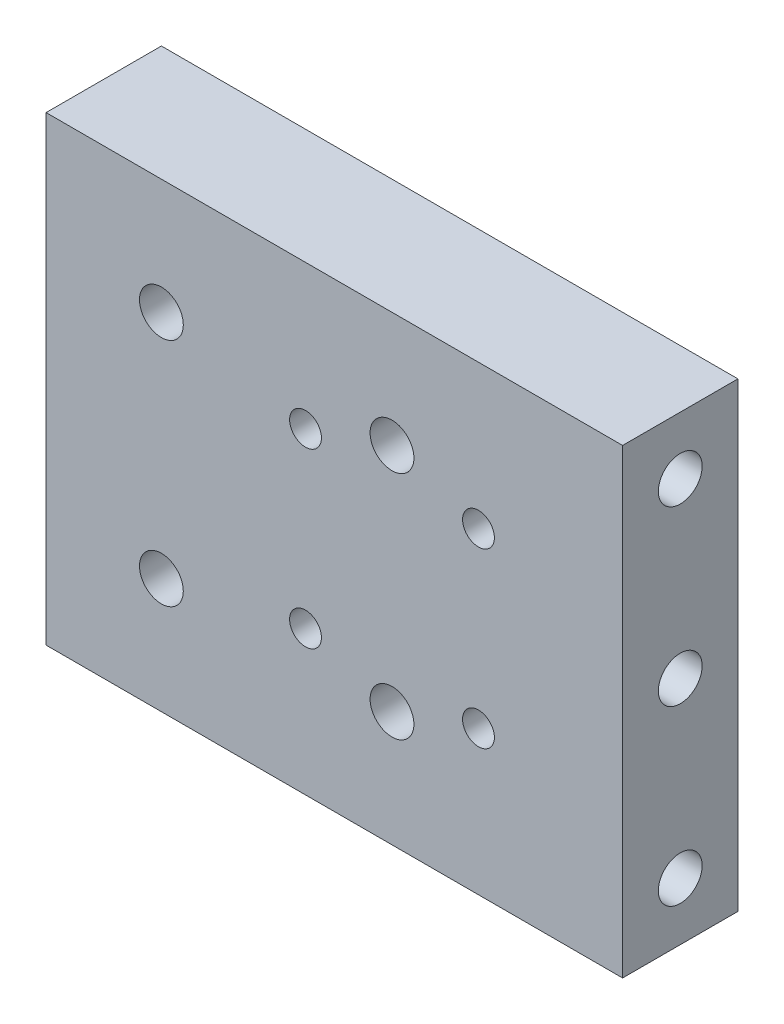
ISO-10303-21;
HEADER;
FILE_DESCRIPTION(('STEP AP214'),'2;1');
FILE_NAME('part.step','',(''),(''),'','','');
FILE_SCHEMA(('AUTOMOTIVE_DESIGN { 1 0 10303 214 1 1 1 1 }'));
ENDSEC;
DATA;
#1=APPLICATION_CONTEXT('core data for automotive mechanical design processes');
#2=APPLICATION_PROTOCOL_DEFINITION('international standard','automotive_design',2000,#1);
#3=PRODUCT_CONTEXT('',#1,'mechanical');
#4=PRODUCT('Part','Part','',(#3));
#5=PRODUCT_RELATED_PRODUCT_CATEGORY('part','',(#4));
#6=PRODUCT_DEFINITION_FORMATION('','',#4);
#7=PRODUCT_DEFINITION_CONTEXT('part definition',#1,'design');
#8=PRODUCT_DEFINITION('design','',#6,#7);
#9=PRODUCT_DEFINITION_SHAPE('','',#8);
#10=(LENGTH_UNIT() NAMED_UNIT(*) SI_UNIT(.MILLI.,.METRE.));
#11=(NAMED_UNIT(*) PLANE_ANGLE_UNIT() SI_UNIT($,.RADIAN.));
#12=(NAMED_UNIT(*) SI_UNIT($,.STERADIAN.) SOLID_ANGLE_UNIT());
#13=UNCERTAINTY_MEASURE_WITH_UNIT(LENGTH_MEASURE(1.E-05),#10,'distance_accuracy_value','');
#14=(GEOMETRIC_REPRESENTATION_CONTEXT(3) GLOBAL_UNCERTAINTY_ASSIGNED_CONTEXT((#13)) GLOBAL_UNIT_ASSIGNED_CONTEXT((#10,
#11,#12)) REPRESENTATION_CONTEXT('',''));
#15=CARTESIAN_POINT('',(0.,0.,0.));
#16=DIRECTION('',(0.,0.,1.));
#17=DIRECTION('',(1.,0.,0.));
#18=AXIS2_PLACEMENT_3D('',#15,#16,#17);
#19=CARTESIAN_POINT('',(0.,0.,6.35));
#20=DIRECTION('',(-1.,0.,0.));
#21=DIRECTION('',(0.,0.,1.));
#22=AXIS2_PLACEMENT_3D('',#19,#20,#21);
#23=PLANE('',#22);
#24=CARTESIAN_POINT('',(0.,44.45,0.));
#25=DIRECTION('',(1.,0.,0.));
#26=DIRECTION('',(0.,0.,-1.));
#27=AXIS2_PLACEMENT_3D('',#24,#25,#26);
#28=CIRCLE('',#27,2.41299999999999);
#29=CARTESIAN_POINT('',(0.,44.45,-2.41299999999999));
#30=VERTEX_POINT('',#29);
#31=EDGE_CURVE('E138',#30,#30,#28,.T.);
#32=ORIENTED_EDGE('',*,*,#31,.F.);
#33=EDGE_LOOP('',(#32));
#34=FACE_BOUND('',#33,.T.);
#35=CARTESIAN_POINT('',(0.,25.4,0.));
#36=DIRECTION('',(1.,0.,0.));
#37=DIRECTION('',(0.,0.,-1.));
#38=AXIS2_PLACEMENT_3D('',#35,#36,#37);
#39=CIRCLE('',#38,2.41299999999999);
#40=CARTESIAN_POINT('',(0.,25.4,-2.413));
#41=VERTEX_POINT('',#40);
#42=EDGE_CURVE('E132',#41,#41,#39,.T.);
#43=ORIENTED_EDGE('',*,*,#42,.F.);
#44=EDGE_LOOP('',(#43));
#45=FACE_BOUND('',#44,.T.);
#46=CARTESIAN_POINT('',(0.,6.35,0.));
#47=DIRECTION('',(1.,0.,0.));
#48=DIRECTION('',(0.,0.,-1.));
#49=AXIS2_PLACEMENT_3D('',#46,#47,#48);
#50=CIRCLE('',#49,2.41299999999999);
#51=CARTESIAN_POINT('',(0.,6.35,-2.413));
#52=VERTEX_POINT('',#51);
#53=EDGE_CURVE('E126',#52,#52,#50,.T.);
#54=ORIENTED_EDGE('',*,*,#53,.F.);
#55=EDGE_LOOP('',(#54));
#56=FACE_BOUND('',#55,.T.);
#57=DIRECTION('',(0.,1.,0.));
#58=VECTOR('',#57,1.);
#59=CARTESIAN_POINT('',(0.,0.,-6.35));
#60=LINE('',#59,#58);
#61=CARTESIAN_POINT('',(0.,0.,-6.35));
#62=VERTEX_POINT('',#61);
#63=CARTESIAN_POINT('',(0.,50.8,-6.35));
#64=VERTEX_POINT('',#63);
#65=EDGE_CURVE('E110',#62,#64,#60,.T.);
#66=ORIENTED_EDGE('',*,*,#65,.T.);
#67=DIRECTION('',(0.,0.,-1.));
#68=VECTOR('',#67,1.);
#69=CARTESIAN_POINT('',(0.,50.8,6.35));
#70=LINE('',#69,#68);
#71=CARTESIAN_POINT('',(0.,50.8,6.35));
#72=VERTEX_POINT('',#71);
#73=EDGE_CURVE('E13',#72,#64,#70,.T.);
#74=ORIENTED_EDGE('',*,*,#73,.F.);
#75=DIRECTION('',(0.,1.,0.));
#76=VECTOR('',#75,1.);
#77=CARTESIAN_POINT('',(0.,0.,6.35));
#78=LINE('',#77,#76);
#79=CARTESIAN_POINT('',(0.,0.,6.35));
#80=VERTEX_POINT('',#79);
#81=EDGE_CURVE('E98',#80,#72,#78,.T.);
#82=ORIENTED_EDGE('',*,*,#81,.F.);
#83=DIRECTION('',(0.,0.,-1.));
#84=VECTOR('',#83,1.);
#85=CARTESIAN_POINT('',(0.,0.,6.35));
#86=LINE('',#85,#84);
#87=EDGE_CURVE('E106',#80,#62,#86,.T.);
#88=ORIENTED_EDGE('',*,*,#87,.T.);
#89=EDGE_LOOP('',(#66,#74,#82,#88));
#90=FACE_BOUND('',#89,.T.);
#91=ADVANCED_FACE('F47',(#34,#45,#56,#90),#23,.F.);
#92=CARTESIAN_POINT('',(0.,50.8,6.35));
#93=DIRECTION('',(0.,-1.,0.));
#94=DIRECTION('',(1.,0.,0.));
#95=AXIS2_PLACEMENT_3D('',#92,#93,#94);
#96=PLANE('',#95);
#97=DIRECTION('',(-1.,0.,0.));
#98=VECTOR('',#97,1.);
#99=CARTESIAN_POINT('',(0.,50.8,-6.35));
#100=LINE('',#99,#98);
#101=CARTESIAN_POINT('',(-63.5,50.8,-6.35));
#102=VERTEX_POINT('',#101);
#103=EDGE_CURVE('E102',#64,#102,#100,.T.);
#104=ORIENTED_EDGE('',*,*,#103,.T.);
#105=DIRECTION('',(0.,0.,-1.));
#106=VECTOR('',#105,1.);
#107=CARTESIAN_POINT('',(-63.5,50.8,6.35));
#108=LINE('',#107,#106);
#109=CARTESIAN_POINT('',(-63.5,50.8,6.35));
#110=VERTEX_POINT('',#109);
#111=EDGE_CURVE('E55',#110,#102,#108,.T.);
#112=ORIENTED_EDGE('',*,*,#111,.F.);
#113=DIRECTION('',(-1.,0.,0.));
#114=VECTOR('',#113,1.);
#115=CARTESIAN_POINT('',(0.,50.8,6.35));
#116=LINE('',#115,#114);
#117=EDGE_CURVE('E93',#72,#110,#116,.T.);
#118=ORIENTED_EDGE('',*,*,#117,.F.);
#119=ORIENTED_EDGE('',*,*,#73,.T.);
#120=EDGE_LOOP('',(#104,#112,#118,#119));
#121=FACE_BOUND('',#120,.T.);
#122=ADVANCED_FACE('F101',(#121),#96,.F.);
#123=CARTESIAN_POINT('',(-63.5,0.,6.35));
#124=DIRECTION('',(1.,0.,0.));
#125=DIRECTION('',(0.,0.,-1.));
#126=AXIS2_PLACEMENT_3D('',#123,#124,#125);
#127=PLANE('',#126);
#128=CARTESIAN_POINT('',(-63.5,44.45,0.));
#129=DIRECTION('',(1.,0.,0.));
#130=DIRECTION('',(0.,0.,-1.));
#131=AXIS2_PLACEMENT_3D('',#128,#129,#130);
#132=CIRCLE('',#131,2.41299999999998);
#133=CARTESIAN_POINT('',(-63.5,44.45,-2.41299999999999));
#134=VERTEX_POINT('',#133);
#135=EDGE_CURVE('E135',#134,#134,#132,.T.);
#136=ORIENTED_EDGE('',*,*,#135,.T.);
#137=EDGE_LOOP('',(#136));
#138=FACE_BOUND('',#137,.T.);
#139=CARTESIAN_POINT('',(-63.5,25.4,0.));
#140=DIRECTION('',(1.,0.,0.));
#141=DIRECTION('',(0.,0.,-1.));
#142=AXIS2_PLACEMENT_3D('',#139,#140,#141);
#143=CIRCLE('',#142,2.41299999999998);
#144=CARTESIAN_POINT('',(-63.5,25.4,-2.41299999999999));
#145=VERTEX_POINT('',#144);
#146=EDGE_CURVE('E129',#145,#145,#143,.T.);
#147=ORIENTED_EDGE('',*,*,#146,.T.);
#148=EDGE_LOOP('',(#147));
#149=FACE_BOUND('',#148,.T.);
#150=CARTESIAN_POINT('',(-63.5,6.35,0.));
#151=DIRECTION('',(1.,0.,0.));
#152=DIRECTION('',(0.,0.,-1.));
#153=AXIS2_PLACEMENT_3D('',#150,#151,#152);
#154=CIRCLE('',#153,2.41299999999998);
#155=CARTESIAN_POINT('',(-63.5,6.35,-2.41299999999999));
#156=VERTEX_POINT('',#155);
#157=EDGE_CURVE('E113',#156,#156,#154,.T.);
#158=ORIENTED_EDGE('',*,*,#157,.T.);
#159=EDGE_LOOP('',(#158));
#160=FACE_BOUND('',#159,.T.);
#161=DIRECTION('',(0.,-1.,0.));
#162=VECTOR('',#161,1.);
#163=CARTESIAN_POINT('',(-63.5,0.,-6.35));
#164=LINE('',#163,#162);
#165=CARTESIAN_POINT('',(-63.5,0.,-6.35));
#166=VERTEX_POINT('',#165);
#167=EDGE_CURVE('E80',#102,#166,#164,.T.);
#168=ORIENTED_EDGE('',*,*,#167,.T.);
#169=DIRECTION('',(0.,0.,-1.));
#170=VECTOR('',#169,1.);
#171=CARTESIAN_POINT('',(-63.5,0.,6.35));
#172=LINE('',#171,#170);
#173=CARTESIAN_POINT('',(-63.5,0.,6.35));
#174=VERTEX_POINT('',#173);
#175=EDGE_CURVE('E103',#174,#166,#172,.T.);
#176=ORIENTED_EDGE('',*,*,#175,.F.);
#177=DIRECTION('',(0.,-1.,0.));
#178=VECTOR('',#177,1.);
#179=CARTESIAN_POINT('',(-63.5,0.,6.35));
#180=LINE('',#179,#178);
#181=EDGE_CURVE('E96',#110,#174,#180,.T.);
#182=ORIENTED_EDGE('',*,*,#181,.F.);
#183=ORIENTED_EDGE('',*,*,#111,.T.);
#184=EDGE_LOOP('',(#168,#176,#182,#183));
#185=FACE_BOUND('',#184,.T.);
#186=ADVANCED_FACE('F104',(#138,#149,#160,#185),#127,.F.);
#187=CARTESIAN_POINT('',(0.,0.,6.35));
#188=DIRECTION('',(0.,1.,0.));
#189=DIRECTION('',(-1.,0.,0.));
#190=AXIS2_PLACEMENT_3D('',#187,#188,#189);
#191=PLANE('',#190);
#192=DIRECTION('',(1.,0.,0.));
#193=VECTOR('',#192,1.);
#194=CARTESIAN_POINT('',(0.,0.,-6.35));
#195=LINE('',#194,#193);
#196=EDGE_CURVE('E86',#166,#62,#195,.T.);
#197=ORIENTED_EDGE('',*,*,#196,.T.);
#198=ORIENTED_EDGE('',*,*,#87,.F.);
#199=DIRECTION('',(1.,0.,0.));
#200=VECTOR('',#199,1.);
#201=CARTESIAN_POINT('',(0.,0.,6.35));
#202=LINE('',#201,#200);
#203=EDGE_CURVE('E63',#174,#80,#202,.T.);
#204=ORIENTED_EDGE('',*,*,#203,.F.);
#205=ORIENTED_EDGE('',*,*,#175,.T.);
#206=EDGE_LOOP('',(#197,#198,#204,#205));
#207=FACE_BOUND('',#206,.T.);
#208=ADVANCED_FACE('F118',(#207),#191,.F.);
#209=CARTESIAN_POINT('',(0.,0.,6.35));
#210=DIRECTION('',(0.,0.,1.));
#211=DIRECTION('',(1.,0.,0.));
#212=AXIS2_PLACEMENT_3D('',#209,#210,#211);
#213=PLANE('',#212);
#214=CARTESIAN_POINT('',(-34.925,34.925,6.35));
#215=DIRECTION('',(0.,0.,1.));
#216=DIRECTION('',(1.,0.,0.));
#217=AXIS2_PLACEMENT_3D('',#214,#215,#216);
#218=CIRCLE('',#217,1.7526);
#219=CARTESIAN_POINT('',(-33.1724,34.925,6.35));
#220=VERTEX_POINT('',#219);
#221=EDGE_CURVE('E186',#220,#220,#218,.T.);
#222=ORIENTED_EDGE('',*,*,#221,.F.);
#223=EDGE_LOOP('',(#222));
#224=FACE_BOUND('',#223,.T.);
#225=CARTESIAN_POINT('',(-15.875,34.925,6.35));
#226=DIRECTION('',(0.,0.,1.));
#227=DIRECTION('',(1.,0.,0.));
#228=AXIS2_PLACEMENT_3D('',#225,#226,#227);
#229=CIRCLE('',#228,1.7526);
#230=CARTESIAN_POINT('',(-14.1224,34.925,6.35));
#231=VERTEX_POINT('',#230);
#232=EDGE_CURVE('E180',#231,#231,#229,.T.);
#233=ORIENTED_EDGE('',*,*,#232,.F.);
#234=EDGE_LOOP('',(#233));
#235=FACE_BOUND('',#234,.T.);
#236=CARTESIAN_POINT('',(-15.875,15.875,6.35));
#237=DIRECTION('',(0.,0.,1.));
#238=DIRECTION('',(1.,0.,0.));
#239=AXIS2_PLACEMENT_3D('',#236,#237,#238);
#240=CIRCLE('',#239,1.7526);
#241=CARTESIAN_POINT('',(-14.1224,15.875,6.35));
#242=VERTEX_POINT('',#241);
#243=EDGE_CURVE('E174',#242,#242,#240,.T.);
#244=ORIENTED_EDGE('',*,*,#243,.F.);
#245=EDGE_LOOP('',(#244));
#246=FACE_BOUND('',#245,.T.);
#247=CARTESIAN_POINT('',(-34.925,15.875,6.35));
#248=DIRECTION('',(0.,0.,1.));
#249=DIRECTION('',(1.,0.,0.));
#250=AXIS2_PLACEMENT_3D('',#247,#248,#249);
#251=CIRCLE('',#250,1.7526);
#252=CARTESIAN_POINT('',(-33.1724,15.875,6.35));
#253=VERTEX_POINT('',#252);
#254=EDGE_CURVE('E168',#253,#253,#251,.T.);
#255=ORIENTED_EDGE('',*,*,#254,.F.);
#256=EDGE_LOOP('',(#255));
#257=FACE_BOUND('',#256,.T.);
#258=CARTESIAN_POINT('',(-50.8,38.1,6.35));
#259=DIRECTION('',(0.,0.,1.));
#260=DIRECTION('',(1.,0.,0.));
#261=AXIS2_PLACEMENT_3D('',#258,#259,#260);
#262=CIRCLE('',#261,2.41299999999998);
#263=CARTESIAN_POINT('',(-48.387,38.1,6.35));
#264=VERTEX_POINT('',#263);
#265=EDGE_CURVE('E162',#264,#264,#262,.T.);
#266=ORIENTED_EDGE('',*,*,#265,.F.);
#267=EDGE_LOOP('',(#266));
#268=FACE_BOUND('',#267,.T.);
#269=CARTESIAN_POINT('',(-25.4,38.1,6.35));
#270=DIRECTION('',(0.,0.,1.));
#271=DIRECTION('',(1.,0.,0.));
#272=AXIS2_PLACEMENT_3D('',#269,#270,#271);
#273=CIRCLE('',#272,2.41299999999999);
#274=CARTESIAN_POINT('',(-22.987,38.1,6.35));
#275=VERTEX_POINT('',#274);
#276=EDGE_CURVE('E156',#275,#275,#273,.T.);
#277=ORIENTED_EDGE('',*,*,#276,.F.);
#278=EDGE_LOOP('',(#277));
#279=FACE_BOUND('',#278,.T.);
#280=CARTESIAN_POINT('',(-50.8,12.7,6.35));
#281=DIRECTION('',(0.,0.,1.));
#282=DIRECTION('',(1.,0.,0.));
#283=AXIS2_PLACEMENT_3D('',#280,#281,#282);
#284=CIRCLE('',#283,2.41299999999998);
#285=CARTESIAN_POINT('',(-48.387,12.7,6.35));
#286=VERTEX_POINT('',#285);
#287=EDGE_CURVE('E150',#286,#286,#284,.T.);
#288=ORIENTED_EDGE('',*,*,#287,.F.);
#289=EDGE_LOOP('',(#288));
#290=FACE_BOUND('',#289,.T.);
#291=CARTESIAN_POINT('',(-25.4,12.7,6.35));
#292=DIRECTION('',(0.,0.,1.));
#293=DIRECTION('',(1.,0.,0.));
#294=AXIS2_PLACEMENT_3D('',#291,#292,#293);
#295=CIRCLE('',#294,2.41299999999999);
#296=CARTESIAN_POINT('',(-22.987,12.7,6.35));
#297=VERTEX_POINT('',#296);
#298=EDGE_CURVE('E144',#297,#297,#295,.T.);
#299=ORIENTED_EDGE('',*,*,#298,.F.);
#300=EDGE_LOOP('',(#299));
#301=FACE_BOUND('',#300,.T.);
#302=ORIENTED_EDGE('',*,*,#81,.T.);
#303=ORIENTED_EDGE('',*,*,#117,.T.);
#304=ORIENTED_EDGE('',*,*,#181,.T.);
#305=ORIENTED_EDGE('',*,*,#203,.T.);
#306=EDGE_LOOP('',(#302,#303,#304,#305));
#307=FACE_BOUND('',#306,.T.);
#308=ADVANCED_FACE('F94',(#224,#235,#246,#257,#268,#279,#290,#301,#307),#213,.T.);
#309=CARTESIAN_POINT('',(0.,0.,-6.35));
#310=DIRECTION('',(0.,0.,1.));
#311=DIRECTION('',(1.,0.,0.));
#312=AXIS2_PLACEMENT_3D('',#309,#310,#311);
#313=PLANE('',#312);
#314=CARTESIAN_POINT('',(-34.925,34.925,-6.35));
#315=DIRECTION('',(0.,0.,1.));
#316=DIRECTION('',(1.,0.,0.));
#317=AXIS2_PLACEMENT_3D('',#314,#315,#316);
#318=CIRCLE('',#317,1.75259999999999);
#319=CARTESIAN_POINT('',(-33.1724,34.925,-6.35));
#320=VERTEX_POINT('',#319);
#321=EDGE_CURVE('E183',#320,#320,#318,.T.);
#322=ORIENTED_EDGE('',*,*,#321,.T.);
#323=EDGE_LOOP('',(#322));
#324=FACE_BOUND('',#323,.T.);
#325=CARTESIAN_POINT('',(-15.875,34.925,-6.35));
#326=DIRECTION('',(0.,0.,1.));
#327=DIRECTION('',(1.,0.,0.));
#328=AXIS2_PLACEMENT_3D('',#325,#326,#327);
#329=CIRCLE('',#328,1.7526);
#330=CARTESIAN_POINT('',(-14.1224,34.925,-6.35));
#331=VERTEX_POINT('',#330);
#332=EDGE_CURVE('E177',#331,#331,#329,.T.);
#333=ORIENTED_EDGE('',*,*,#332,.T.);
#334=EDGE_LOOP('',(#333));
#335=FACE_BOUND('',#334,.T.);
#336=CARTESIAN_POINT('',(-15.875,15.875,-6.35));
#337=DIRECTION('',(0.,0.,1.));
#338=DIRECTION('',(1.,0.,0.));
#339=AXIS2_PLACEMENT_3D('',#336,#337,#338);
#340=CIRCLE('',#339,1.7526);
#341=CARTESIAN_POINT('',(-14.1224,15.875,-6.35));
#342=VERTEX_POINT('',#341);
#343=EDGE_CURVE('E171',#342,#342,#340,.T.);
#344=ORIENTED_EDGE('',*,*,#343,.T.);
#345=EDGE_LOOP('',(#344));
#346=FACE_BOUND('',#345,.T.);
#347=CARTESIAN_POINT('',(-34.925,15.875,-6.35));
#348=DIRECTION('',(0.,0.,1.));
#349=DIRECTION('',(1.,0.,0.));
#350=AXIS2_PLACEMENT_3D('',#347,#348,#349);
#351=CIRCLE('',#350,1.75259999999999);
#352=CARTESIAN_POINT('',(-33.1724,15.875,-6.35));
#353=VERTEX_POINT('',#352);
#354=EDGE_CURVE('E165',#353,#353,#351,.T.);
#355=ORIENTED_EDGE('',*,*,#354,.T.);
#356=EDGE_LOOP('',(#355));
#357=FACE_BOUND('',#356,.T.);
#358=CARTESIAN_POINT('',(-50.8,38.1,-6.35));
#359=DIRECTION('',(0.,0.,1.));
#360=DIRECTION('',(1.,0.,0.));
#361=AXIS2_PLACEMENT_3D('',#358,#359,#360);
#362=CIRCLE('',#361,2.41299999999999);
#363=CARTESIAN_POINT('',(-48.387,38.1,-6.35));
#364=VERTEX_POINT('',#363);
#365=EDGE_CURVE('E159',#364,#364,#362,.T.);
#366=ORIENTED_EDGE('',*,*,#365,.T.);
#367=EDGE_LOOP('',(#366));
#368=FACE_BOUND('',#367,.T.);
#369=CARTESIAN_POINT('',(-25.4,38.1,-6.35));
#370=DIRECTION('',(0.,0.,1.));
#371=DIRECTION('',(1.,0.,0.));
#372=AXIS2_PLACEMENT_3D('',#369,#370,#371);
#373=CIRCLE('',#372,2.41299999999999);
#374=CARTESIAN_POINT('',(-22.987,38.1,-6.35));
#375=VERTEX_POINT('',#374);
#376=EDGE_CURVE('E153',#375,#375,#373,.T.);
#377=ORIENTED_EDGE('',*,*,#376,.T.);
#378=EDGE_LOOP('',(#377));
#379=FACE_BOUND('',#378,.T.);
#380=CARTESIAN_POINT('',(-50.8,12.7,-6.35));
#381=DIRECTION('',(0.,0.,1.));
#382=DIRECTION('',(1.,0.,0.));
#383=AXIS2_PLACEMENT_3D('',#380,#381,#382);
#384=CIRCLE('',#383,2.41299999999999);
#385=CARTESIAN_POINT('',(-48.387,12.7,-6.35));
#386=VERTEX_POINT('',#385);
#387=EDGE_CURVE('E147',#386,#386,#384,.T.);
#388=ORIENTED_EDGE('',*,*,#387,.T.);
#389=EDGE_LOOP('',(#388));
#390=FACE_BOUND('',#389,.T.);
#391=CARTESIAN_POINT('',(-25.4,12.7,-6.35));
#392=DIRECTION('',(0.,0.,1.));
#393=DIRECTION('',(1.,0.,0.));
#394=AXIS2_PLACEMENT_3D('',#391,#392,#393);
#395=CIRCLE('',#394,2.41299999999999);
#396=CARTESIAN_POINT('',(-22.987,12.7,-6.35));
#397=VERTEX_POINT('',#396);
#398=EDGE_CURVE('E141',#397,#397,#395,.T.);
#399=ORIENTED_EDGE('',*,*,#398,.T.);
#400=EDGE_LOOP('',(#399));
#401=FACE_BOUND('',#400,.T.);
#402=ORIENTED_EDGE('',*,*,#65,.F.);
#403=ORIENTED_EDGE('',*,*,#196,.F.);
#404=ORIENTED_EDGE('',*,*,#167,.F.);
#405=ORIENTED_EDGE('',*,*,#103,.F.);
#406=EDGE_LOOP('',(#402,#403,#404,#405));
#407=FACE_BOUND('',#406,.T.);
#408=ADVANCED_FACE('F121',(#324,#335,#346,#357,#368,#379,#390,#401,#407),#313,.F.);
#409=CARTESIAN_POINT('',(0.,6.35,0.));
#410=DIRECTION('',(1.,0.,0.));
#411=DIRECTION('',(0.,0.,-1.));
#412=AXIS2_PLACEMENT_3D('',#409,#410,#411);
#413=CYLINDRICAL_SURFACE('',#412,2.41299999999999);
#414=ORIENTED_EDGE('',*,*,#157,.F.);
#415=EDGE_LOOP('',(#414));
#416=FACE_BOUND('',#415,.T.);
#417=ORIENTED_EDGE('',*,*,#53,.T.);
#418=EDGE_LOOP('',(#417));
#419=FACE_BOUND('',#418,.T.);
#420=ADVANCED_FACE('F237',(#416,#419),#413,.F.);
#421=CARTESIAN_POINT('',(0.,25.4,0.));
#422=DIRECTION('',(1.,0.,0.));
#423=DIRECTION('',(0.,0.,-1.));
#424=AXIS2_PLACEMENT_3D('',#421,#422,#423);
#425=CYLINDRICAL_SURFACE('',#424,2.41299999999999);
#426=ORIENTED_EDGE('',*,*,#146,.F.);
#427=EDGE_LOOP('',(#426));
#428=FACE_BOUND('',#427,.T.);
#429=ORIENTED_EDGE('',*,*,#42,.T.);
#430=EDGE_LOOP('',(#429));
#431=FACE_BOUND('',#430,.T.);
#432=ADVANCED_FACE('F222',(#428,#431),#425,.F.);
#433=CARTESIAN_POINT('',(0.,44.45,0.));
#434=DIRECTION('',(1.,0.,0.));
#435=DIRECTION('',(0.,0.,-1.));
#436=AXIS2_PLACEMENT_3D('',#433,#434,#435);
#437=CYLINDRICAL_SURFACE('',#436,2.41299999999999);
#438=ORIENTED_EDGE('',*,*,#135,.F.);
#439=EDGE_LOOP('',(#438));
#440=FACE_BOUND('',#439,.T.);
#441=ORIENTED_EDGE('',*,*,#31,.T.);
#442=EDGE_LOOP('',(#441));
#443=FACE_BOUND('',#442,.T.);
#444=ADVANCED_FACE('F212',(#440,#443),#437,.F.);
#445=CARTESIAN_POINT('',(-25.4,12.7,6.35));
#446=DIRECTION('',(0.,0.,1.));
#447=DIRECTION('',(1.,0.,0.));
#448=AXIS2_PLACEMENT_3D('',#445,#446,#447);
#449=CYLINDRICAL_SURFACE('',#448,2.41299999999999);
#450=ORIENTED_EDGE('',*,*,#398,.F.);
#451=EDGE_LOOP('',(#450));
#452=FACE_BOUND('',#451,.T.);
#453=ORIENTED_EDGE('',*,*,#298,.T.);
#454=EDGE_LOOP('',(#453));
#455=FACE_BOUND('',#454,.T.);
#456=ADVANCED_FACE('F209',(#452,#455),#449,.F.);
#457=CARTESIAN_POINT('',(-50.8,12.7,6.35));
#458=DIRECTION('',(0.,0.,1.));
#459=DIRECTION('',(1.,0.,0.));
#460=AXIS2_PLACEMENT_3D('',#457,#458,#459);
#461=CYLINDRICAL_SURFACE('',#460,2.41299999999999);
#462=ORIENTED_EDGE('',*,*,#387,.F.);
#463=EDGE_LOOP('',(#462));
#464=FACE_BOUND('',#463,.T.);
#465=ORIENTED_EDGE('',*,*,#287,.T.);
#466=EDGE_LOOP('',(#465));
#467=FACE_BOUND('',#466,.T.);
#468=ADVANCED_FACE('F211',(#464,#467),#461,.F.);
#469=CARTESIAN_POINT('',(-25.4,38.1,6.35));
#470=DIRECTION('',(0.,0.,1.));
#471=DIRECTION('',(1.,0.,0.));
#472=AXIS2_PLACEMENT_3D('',#469,#470,#471);
#473=CYLINDRICAL_SURFACE('',#472,2.41299999999999);
#474=ORIENTED_EDGE('',*,*,#376,.F.);
#475=EDGE_LOOP('',(#474));
#476=FACE_BOUND('',#475,.T.);
#477=ORIENTED_EDGE('',*,*,#276,.T.);
#478=EDGE_LOOP('',(#477));
#479=FACE_BOUND('',#478,.T.);
#480=ADVANCED_FACE('F219',(#476,#479),#473,.F.);
#481=CARTESIAN_POINT('',(-50.8,38.1,6.35));
#482=DIRECTION('',(0.,0.,1.));
#483=DIRECTION('',(1.,0.,0.));
#484=AXIS2_PLACEMENT_3D('',#481,#482,#483);
#485=CYLINDRICAL_SURFACE('',#484,2.41299999999999);
#486=ORIENTED_EDGE('',*,*,#365,.F.);
#487=EDGE_LOOP('',(#486));
#488=FACE_BOUND('',#487,.T.);
#489=ORIENTED_EDGE('',*,*,#265,.T.);
#490=EDGE_LOOP('',(#489));
#491=FACE_BOUND('',#490,.T.);
#492=ADVANCED_FACE('F290',(#488,#491),#485,.F.);
#493=CARTESIAN_POINT('',(-34.925,15.875,6.35));
#494=DIRECTION('',(0.,0.,1.));
#495=DIRECTION('',(1.,0.,0.));
#496=AXIS2_PLACEMENT_3D('',#493,#494,#495);
#497=CYLINDRICAL_SURFACE('',#496,1.7526);
#498=ORIENTED_EDGE('',*,*,#354,.F.);
#499=EDGE_LOOP('',(#498));
#500=FACE_BOUND('',#499,.T.);
#501=ORIENTED_EDGE('',*,*,#254,.T.);
#502=EDGE_LOOP('',(#501));
#503=FACE_BOUND('',#502,.T.);
#504=ADVANCED_FACE('F284',(#500,#503),#497,.F.);
#505=CARTESIAN_POINT('',(-15.875,15.875,6.35));
#506=DIRECTION('',(0.,0.,1.));
#507=DIRECTION('',(1.,0.,0.));
#508=AXIS2_PLACEMENT_3D('',#505,#506,#507);
#509=CYLINDRICAL_SURFACE('',#508,1.7526);
#510=ORIENTED_EDGE('',*,*,#343,.F.);
#511=EDGE_LOOP('',(#510));
#512=FACE_BOUND('',#511,.T.);
#513=ORIENTED_EDGE('',*,*,#243,.T.);
#514=EDGE_LOOP('',(#513));
#515=FACE_BOUND('',#514,.T.);
#516=ADVANCED_FACE('F289',(#512,#515),#509,.F.);
#517=CARTESIAN_POINT('',(-15.875,34.925,6.35));
#518=DIRECTION('',(0.,0.,1.));
#519=DIRECTION('',(1.,0.,0.));
#520=AXIS2_PLACEMENT_3D('',#517,#518,#519);
#521=CYLINDRICAL_SURFACE('',#520,1.7526);
#522=ORIENTED_EDGE('',*,*,#332,.F.);
#523=EDGE_LOOP('',(#522));
#524=FACE_BOUND('',#523,.T.);
#525=ORIENTED_EDGE('',*,*,#232,.T.);
#526=EDGE_LOOP('',(#525));
#527=FACE_BOUND('',#526,.T.);
#528=ADVANCED_FACE('F302',(#524,#527),#521,.F.);
#529=CARTESIAN_POINT('',(-34.925,34.925,6.35));
#530=DIRECTION('',(0.,0.,1.));
#531=DIRECTION('',(1.,0.,0.));
#532=AXIS2_PLACEMENT_3D('',#529,#530,#531);
#533=CYLINDRICAL_SURFACE('',#532,1.7526);
#534=ORIENTED_EDGE('',*,*,#321,.F.);
#535=EDGE_LOOP('',(#534));
#536=FACE_BOUND('',#535,.T.);
#537=ORIENTED_EDGE('',*,*,#221,.T.);
#538=EDGE_LOOP('',(#537));
#539=FACE_BOUND('',#538,.T.);
#540=ADVANCED_FACE('F190',(#536,#539),#533,.F.);
#541=CLOSED_SHELL('',(#91,#122,#186,#208,#308,#408,#420,#432,#444,#456,#468,#480,#492,#504,#516,
#528,#540));
#542=MANIFOLD_SOLID_BREP('B2',#541);
#543=ADVANCED_BREP_SHAPE_REPRESENTATION('',(#18,#542),#14);
#544=SHAPE_DEFINITION_REPRESENTATION(#9,#543);
ENDSEC;
END-ISO-10303-21;
